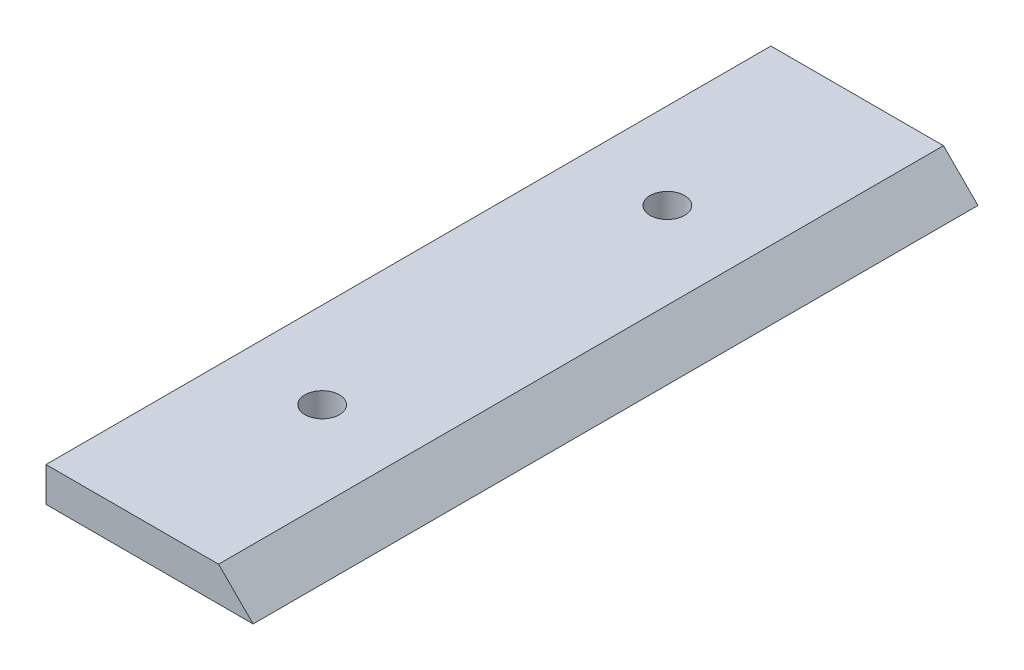
ISO-10303-21;
HEADER;
FILE_DESCRIPTION(('STEP AP214'),'2;1');
FILE_NAME('part.step','',(''),(''),'','','');
FILE_SCHEMA(('AUTOMOTIVE_DESIGN { 1 0 10303 214 1 1 1 1 }'));
ENDSEC;
DATA;
#1=APPLICATION_CONTEXT('core data for automotive mechanical design processes');
#2=APPLICATION_PROTOCOL_DEFINITION('international standard','automotive_design',2000,#1);
#3=PRODUCT_CONTEXT('',#1,'mechanical');
#4=PRODUCT('Part','Part','',(#3));
#5=PRODUCT_RELATED_PRODUCT_CATEGORY('part','',(#4));
#6=PRODUCT_DEFINITION_FORMATION('','',#4);
#7=PRODUCT_DEFINITION_CONTEXT('part definition',#1,'design');
#8=PRODUCT_DEFINITION('design','',#6,#7);
#9=PRODUCT_DEFINITION_SHAPE('','',#8);
#10=(LENGTH_UNIT() NAMED_UNIT(*) SI_UNIT(.MILLI.,.METRE.));
#11=(NAMED_UNIT(*) PLANE_ANGLE_UNIT() SI_UNIT($,.RADIAN.));
#12=(NAMED_UNIT(*) SI_UNIT($,.STERADIAN.) SOLID_ANGLE_UNIT());
#13=UNCERTAINTY_MEASURE_WITH_UNIT(LENGTH_MEASURE(1.E-05),#10,'distance_accuracy_value','');
#14=(GEOMETRIC_REPRESENTATION_CONTEXT(3) GLOBAL_UNCERTAINTY_ASSIGNED_CONTEXT((#13)) GLOBAL_UNIT_ASSIGNED_CONTEXT((#10,
#11,#12)) REPRESENTATION_CONTEXT('',''));
#15=CARTESIAN_POINT('',(0.,0.,0.));
#16=DIRECTION('',(0.,0.,1.));
#17=DIRECTION('',(1.,0.,0.));
#18=AXIS2_PLACEMENT_3D('',#15,#16,#17);
#19=CARTESIAN_POINT('',(-25.,5.,105.));
#20=DIRECTION('',(0.,-1.,0.));
#21=DIRECTION('',(0.,0.,-1.));
#22=AXIS2_PLACEMENT_3D('',#19,#20,#21);
#23=PLANE('',#22);
#24=CARTESIAN_POINT('',(0.,5.,-50.));
#25=DIRECTION('',(0.,-1.,0.));
#26=DIRECTION('',(0.,0.,-1.));
#27=AXIS2_PLACEMENT_3D('',#24,#25,#26);
#28=CIRCLE('',#27,5.);
#29=CARTESIAN_POINT('',(0.,5.,-55.));
#30=VERTEX_POINT('',#29);
#31=EDGE_CURVE('E101',#30,#30,#28,.T.);
#32=ORIENTED_EDGE('',*,*,#31,.T.);
#33=EDGE_LOOP('',(#32));
#34=FACE_BOUND('',#33,.T.);
#35=CARTESIAN_POINT('',(0.,5.,50.));
#36=DIRECTION('',(0.,-1.,0.));
#37=DIRECTION('',(0.,0.,-1.));
#38=AXIS2_PLACEMENT_3D('',#35,#36,#37);
#39=CIRCLE('',#38,5.);
#40=CARTESIAN_POINT('',(0.,5.,45.));
#41=VERTEX_POINT('',#40);
#42=EDGE_CURVE('E108',#41,#41,#39,.T.);
#43=ORIENTED_EDGE('',*,*,#42,.T.);
#44=EDGE_LOOP('',(#43));
#45=FACE_BOUND('',#44,.T.);
#46=DIRECTION('',(-1.,0.,0.));
#47=VECTOR('',#46,1.);
#48=CARTESIAN_POINT('',(-25.,5.,-105.));
#49=LINE('',#48,#47);
#50=CARTESIAN_POINT('',(25.,5.,-105.));
#51=VERTEX_POINT('',#50);
#52=CARTESIAN_POINT('',(-25.,5.,-105.));
#53=VERTEX_POINT('',#52);
#54=EDGE_CURVE('E98',#51,#53,#49,.T.);
#55=ORIENTED_EDGE('',*,*,#54,.T.);
#56=DIRECTION('',(0.,0.,-1.));
#57=VECTOR('',#56,1.);
#58=CARTESIAN_POINT('',(-25.,5.,105.));
#59=LINE('',#58,#57);
#60=CARTESIAN_POINT('',(-25.,5.,105.));
#61=VERTEX_POINT('',#60);
#62=EDGE_CURVE('E11',#61,#53,#59,.T.);
#63=ORIENTED_EDGE('',*,*,#62,.F.);
#64=DIRECTION('',(-1.,0.,0.));
#65=VECTOR('',#64,1.);
#66=CARTESIAN_POINT('',(-25.,5.,105.));
#67=LINE('',#66,#65);
#68=CARTESIAN_POINT('',(25.,5.,105.));
#69=VERTEX_POINT('',#68);
#70=EDGE_CURVE('E84',#69,#61,#67,.T.);
#71=ORIENTED_EDGE('',*,*,#70,.F.);
#72=DIRECTION('',(0.,0.,-1.));
#73=VECTOR('',#72,1.);
#74=CARTESIAN_POINT('',(25.,5.,105.));
#75=LINE('',#74,#73);
#76=EDGE_CURVE('E94',#69,#51,#75,.T.);
#77=ORIENTED_EDGE('',*,*,#76,.T.);
#78=EDGE_LOOP('',(#55,#63,#71,#77));
#79=FACE_BOUND('',#78,.T.);
#80=ADVANCED_FACE('F32',(#34,#45,#79),#23,.F.);
#81=CARTESIAN_POINT('',(-25.,-5.00000000000001,105.));
#82=DIRECTION('',(1.,0.,0.));
#83=DIRECTION('',(0.,0.,-1.));
#84=AXIS2_PLACEMENT_3D('',#81,#82,#83);
#85=PLANE('',#84);
#86=DIRECTION('',(0.,-1.,0.));
#87=VECTOR('',#86,1.);
#88=CARTESIAN_POINT('',(-25.,-5.00000000000001,-105.));
#89=LINE('',#88,#87);
#90=CARTESIAN_POINT('',(-25.,-5.00000000000001,-105.));
#91=VERTEX_POINT('',#90);
#92=EDGE_CURVE('E89',#53,#91,#89,.T.);
#93=ORIENTED_EDGE('',*,*,#92,.T.);
#94=DIRECTION('',(0.,0.,-1.));
#95=VECTOR('',#94,1.);
#96=CARTESIAN_POINT('',(-25.,-5.00000000000001,105.));
#97=LINE('',#96,#95);
#98=CARTESIAN_POINT('',(-25.,-5.00000000000001,105.));
#99=VERTEX_POINT('',#98);
#100=EDGE_CURVE('E41',#99,#91,#97,.T.);
#101=ORIENTED_EDGE('',*,*,#100,.F.);
#102=DIRECTION('',(0.,-1.,0.));
#103=VECTOR('',#102,1.);
#104=CARTESIAN_POINT('',(-25.,-5.00000000000001,105.));
#105=LINE('',#104,#103);
#106=EDGE_CURVE('E79',#61,#99,#105,.T.);
#107=ORIENTED_EDGE('',*,*,#106,.F.);
#108=ORIENTED_EDGE('',*,*,#62,.T.);
#109=EDGE_LOOP('',(#93,#101,#107,#108));
#110=FACE_BOUND('',#109,.T.);
#111=ADVANCED_FACE('F88',(#110),#85,.F.);
#112=CARTESIAN_POINT('',(35.,-5.,105.));
#113=DIRECTION('',(0.,1.,0.));
#114=DIRECTION('',(-1.,0.,0.));
#115=AXIS2_PLACEMENT_3D('',#112,#113,#114);
#116=PLANE('',#115);
#117=CARTESIAN_POINT('',(0.,-5.,-50.));
#118=DIRECTION('',(0.,1.,0.));
#119=DIRECTION('',(-1.,0.,0.));
#120=AXIS2_PLACEMENT_3D('',#117,#118,#119);
#121=CIRCLE('',#120,5.);
#122=CARTESIAN_POINT('',(-4.99999999999996,-5.,-50.));
#123=VERTEX_POINT('',#122);
#124=EDGE_CURVE('E35',#123,#123,#121,.T.);
#125=ORIENTED_EDGE('',*,*,#124,.T.);
#126=EDGE_LOOP('',(#125));
#127=FACE_BOUND('',#126,.T.);
#128=CARTESIAN_POINT('',(0.,-5.,50.));
#129=DIRECTION('',(0.,1.,0.));
#130=DIRECTION('',(-1.,0.,0.));
#131=AXIS2_PLACEMENT_3D('',#128,#129,#130);
#132=CIRCLE('',#131,5.);
#133=CARTESIAN_POINT('',(-4.99999999999996,-5.,50.));
#134=VERTEX_POINT('',#133);
#135=EDGE_CURVE('E106',#134,#134,#132,.T.);
#136=ORIENTED_EDGE('',*,*,#135,.T.);
#137=EDGE_LOOP('',(#136));
#138=FACE_BOUND('',#137,.T.);
#139=DIRECTION('',(1.,0.,0.));
#140=VECTOR('',#139,1.);
#141=CARTESIAN_POINT('',(35.,-5.,-105.));
#142=LINE('',#141,#140);
#143=CARTESIAN_POINT('',(35.,-5.,-105.));
#144=VERTEX_POINT('',#143);
#145=EDGE_CURVE('E66',#91,#144,#142,.T.);
#146=ORIENTED_EDGE('',*,*,#145,.T.);
#147=DIRECTION('',(0.,0.,-1.));
#148=VECTOR('',#147,1.);
#149=CARTESIAN_POINT('',(35.,-5.,105.));
#150=LINE('',#149,#148);
#151=CARTESIAN_POINT('',(35.,-5.,105.));
#152=VERTEX_POINT('',#151);
#153=EDGE_CURVE('E90',#152,#144,#150,.T.);
#154=ORIENTED_EDGE('',*,*,#153,.F.);
#155=DIRECTION('',(1.,0.,0.));
#156=VECTOR('',#155,1.);
#157=CARTESIAN_POINT('',(-25.,-5.00000000000001,105.));
#158=LINE('',#157,#156);
#159=EDGE_CURVE('E82',#99,#152,#158,.T.);
#160=ORIENTED_EDGE('',*,*,#159,.F.);
#161=ORIENTED_EDGE('',*,*,#100,.T.);
#162=EDGE_LOOP('',(#146,#154,#160,#161));
#163=FACE_BOUND('',#162,.T.);
#164=ADVANCED_FACE('F92',(#127,#138,#163),#116,.F.);
#165=CARTESIAN_POINT('',(25.,5.,105.));
#166=DIRECTION('',(-0.707106781186548,-0.707106781186547,0.));
#167=DIRECTION('',(0.707106781186547,-0.707106781186548,0.));
#168=AXIS2_PLACEMENT_3D('',#165,#166,#167);
#169=PLANE('',#168);
#170=DIRECTION('',(-0.707106781186547,0.707106781186548,0.));
#171=VECTOR('',#170,1.);
#172=CARTESIAN_POINT('',(25.,5.,-105.));
#173=LINE('',#172,#171);
#174=EDGE_CURVE('E72',#144,#51,#173,.T.);
#175=ORIENTED_EDGE('',*,*,#174,.T.);
#176=ORIENTED_EDGE('',*,*,#76,.F.);
#177=DIRECTION('',(-0.707106781186547,0.707106781186548,0.));
#178=VECTOR('',#177,1.);
#179=CARTESIAN_POINT('',(25.,5.,105.));
#180=LINE('',#179,#178);
#181=EDGE_CURVE('E50',#152,#69,#180,.T.);
#182=ORIENTED_EDGE('',*,*,#181,.F.);
#183=ORIENTED_EDGE('',*,*,#153,.T.);
#184=EDGE_LOOP('',(#175,#176,#182,#183));
#185=FACE_BOUND('',#184,.T.);
#186=ADVANCED_FACE('F140',(#185),#169,.F.);
#187=CARTESIAN_POINT('',(0.,0.,105.));
#188=DIRECTION('',(0.,0.,1.));
#189=DIRECTION('',(1.,0.,0.));
#190=AXIS2_PLACEMENT_3D('',#187,#188,#189);
#191=PLANE('',#190);
#192=ORIENTED_EDGE('',*,*,#70,.T.);
#193=ORIENTED_EDGE('',*,*,#106,.T.);
#194=ORIENTED_EDGE('',*,*,#159,.T.);
#195=ORIENTED_EDGE('',*,*,#181,.T.);
#196=EDGE_LOOP('',(#192,#193,#194,#195));
#197=FACE_BOUND('',#196,.T.);
#198=ADVANCED_FACE('F80',(#197),#191,.T.);
#199=CARTESIAN_POINT('',(0.,0.,-105.));
#200=DIRECTION('',(0.,0.,1.));
#201=DIRECTION('',(1.,0.,0.));
#202=AXIS2_PLACEMENT_3D('',#199,#200,#201);
#203=PLANE('',#202);
#204=ORIENTED_EDGE('',*,*,#54,.F.);
#205=ORIENTED_EDGE('',*,*,#174,.F.);
#206=ORIENTED_EDGE('',*,*,#145,.F.);
#207=ORIENTED_EDGE('',*,*,#92,.F.);
#208=EDGE_LOOP('',(#204,#205,#206,#207));
#209=FACE_BOUND('',#208,.T.);
#210=ADVANCED_FACE('F129',(#209),#203,.F.);
#211=CARTESIAN_POINT('',(0.,-50.,50.));
#212=DIRECTION('',(0.,1.,0.));
#213=DIRECTION('',(0.,0.,1.));
#214=AXIS2_PLACEMENT_3D('',#211,#212,#213);
#215=CYLINDRICAL_SURFACE('',#214,5.);
#216=ORIENTED_EDGE('',*,*,#135,.F.);
#217=EDGE_LOOP('',(#216));
#218=FACE_BOUND('',#217,.T.);
#219=ORIENTED_EDGE('',*,*,#42,.F.);
#220=EDGE_LOOP('',(#219));
#221=FACE_BOUND('',#220,.T.);
#222=ADVANCED_FACE('F123',(#218,#221),#215,.F.);
#223=CARTESIAN_POINT('',(0.,-50.,-50.));
#224=DIRECTION('',(0.,1.,0.));
#225=DIRECTION('',(0.,0.,1.));
#226=AXIS2_PLACEMENT_3D('',#223,#224,#225);
#227=CYLINDRICAL_SURFACE('',#226,5.);
#228=ORIENTED_EDGE('',*,*,#124,.F.);
#229=EDGE_LOOP('',(#228));
#230=FACE_BOUND('',#229,.T.);
#231=ORIENTED_EDGE('',*,*,#31,.F.);
#232=EDGE_LOOP('',(#231));
#233=FACE_BOUND('',#232,.T.);
#234=ADVANCED_FACE('F121',(#230,#233),#227,.F.);
#235=CLOSED_SHELL('',(#80,#111,#164,#186,#198,#210,#222,#234));
#236=MANIFOLD_SOLID_BREP('B2',#235);
#237=ADVANCED_BREP_SHAPE_REPRESENTATION('',(#18,#236),#14);
#238=SHAPE_DEFINITION_REPRESENTATION(#9,#237);
ENDSEC;
END-ISO-10303-21;
